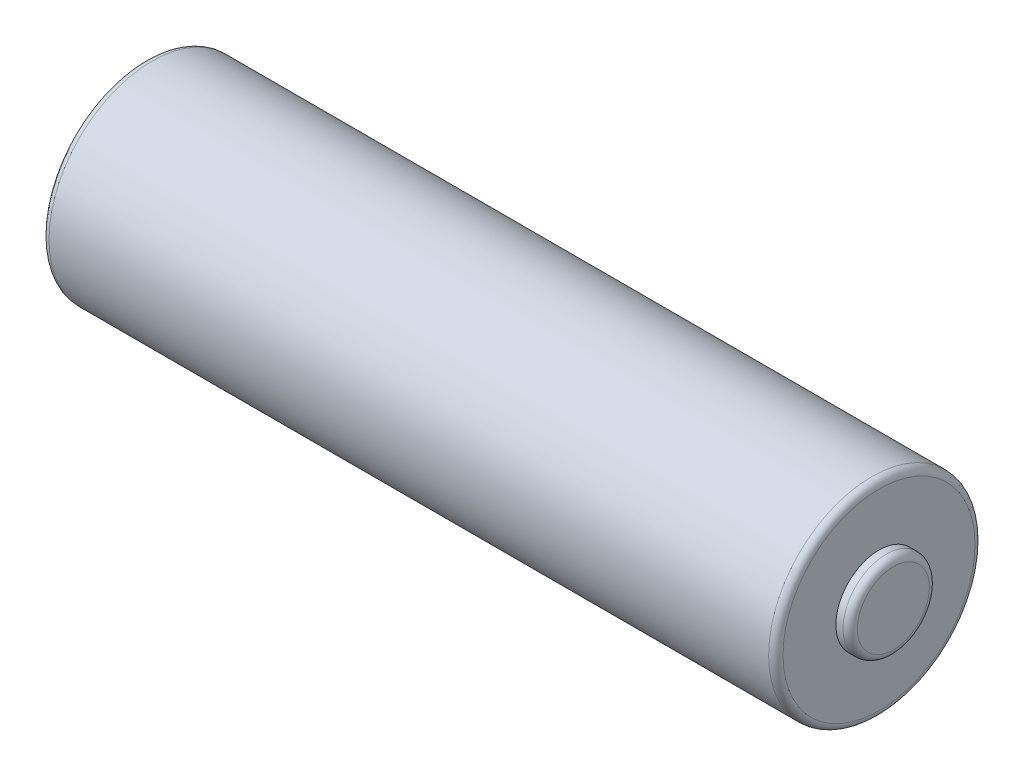
ISO-10303-21;
HEADER;
FILE_DESCRIPTION(('STEP AP214'),'2;1');
FILE_NAME('part.step','',(''),(''),'','','');
FILE_SCHEMA(('AUTOMOTIVE_DESIGN { 1 0 10303 214 1 1 1 1 }'));
ENDSEC;
DATA;
#1=APPLICATION_CONTEXT('core data for automotive mechanical design processes');
#2=APPLICATION_PROTOCOL_DEFINITION('international standard','automotive_design',2000,#1);
#3=PRODUCT_CONTEXT('',#1,'mechanical');
#4=PRODUCT('Part','Part','',(#3));
#5=PRODUCT_RELATED_PRODUCT_CATEGORY('part','',(#4));
#6=PRODUCT_DEFINITION_FORMATION('','',#4);
#7=PRODUCT_DEFINITION_CONTEXT('part definition',#1,'design');
#8=PRODUCT_DEFINITION('design','',#6,#7);
#9=PRODUCT_DEFINITION_SHAPE('','',#8);
#10=(LENGTH_UNIT() NAMED_UNIT(*) SI_UNIT(.MILLI.,.METRE.));
#11=(NAMED_UNIT(*) PLANE_ANGLE_UNIT() SI_UNIT($,.RADIAN.));
#12=(NAMED_UNIT(*) SI_UNIT($,.STERADIAN.) SOLID_ANGLE_UNIT());
#13=UNCERTAINTY_MEASURE_WITH_UNIT(LENGTH_MEASURE(1.E-05),#10,'distance_accuracy_value','');
#14=(GEOMETRIC_REPRESENTATION_CONTEXT(3) GLOBAL_UNCERTAINTY_ASSIGNED_CONTEXT((#13)) GLOBAL_UNIT_ASSIGNED_CONTEXT((#10,
#11,#12)) REPRESENTATION_CONTEXT('',''));
#15=CARTESIAN_POINT('',(0.,0.,0.));
#16=DIRECTION('',(0.,0.,1.));
#17=DIRECTION('',(1.,0.,0.));
#18=AXIS2_PLACEMENT_3D('',#15,#16,#17);
#19=CARTESIAN_POINT('',(25.5,0.,0.));
#20=DIRECTION('',(-1.,0.,0.));
#21=DIRECTION('',(0.,0.,1.));
#22=AXIS2_PLACEMENT_3D('',#19,#20,#21);
#23=CYLINDRICAL_SURFACE('',#22,7.17);
#24=CARTESIAN_POINT('',(-25.,0.,0.));
#25=DIRECTION('',(1.,0.,0.));
#26=DIRECTION('',(0.,0.,-1.));
#27=AXIS2_PLACEMENT_3D('',#24,#25,#26);
#28=CIRCLE('',#27,7.17);
#29=CARTESIAN_POINT('',(-25.,0.,-7.17));
#30=VERTEX_POINT('',#29);
#31=EDGE_CURVE('E57',#30,#30,#28,.T.);
#32=ORIENTED_EDGE('',*,*,#31,.T.);
#33=EDGE_LOOP('',(#32));
#34=FACE_BOUND('',#33,.T.);
#35=CARTESIAN_POINT('',(25.,0.,0.));
#36=DIRECTION('',(1.,0.,0.));
#37=DIRECTION('',(0.,0.,-1.));
#38=AXIS2_PLACEMENT_3D('',#35,#36,#37);
#39=CIRCLE('',#38,7.17);
#40=CARTESIAN_POINT('',(25.,0.,-7.17));
#41=VERTEX_POINT('',#40);
#42=EDGE_CURVE('E61',#41,#41,#39,.F.);
#43=ORIENTED_EDGE('',*,*,#42,.T.);
#44=EDGE_LOOP('',(#43));
#45=FACE_BOUND('',#44,.T.);
#46=ADVANCED_FACE('F42',(#34,#45),#23,.T.);
#47=CARTESIAN_POINT('',(25.5,0.,0.));
#48=DIRECTION('',(1.,0.,0.));
#49=DIRECTION('',(0.,0.,-1.));
#50=AXIS2_PLACEMENT_3D('',#47,#48,#49);
#51=PLANE('',#50);
#52=CARTESIAN_POINT('',(25.5,0.,0.));
#53=DIRECTION('',(1.,0.,0.));
#54=DIRECTION('',(0.,0.,-1.));
#55=AXIS2_PLACEMENT_3D('',#52,#53,#54);
#56=CIRCLE('',#55,6.67);
#57=CARTESIAN_POINT('',(25.5,0.,-6.67));
#58=VERTEX_POINT('',#57);
#59=EDGE_CURVE('E10',#58,#58,#56,.T.);
#60=ORIENTED_EDGE('',*,*,#59,.T.);
#61=EDGE_LOOP('',(#60));
#62=FACE_BOUND('',#61,.T.);
#63=CARTESIAN_POINT('',(25.5,0.,0.));
#64=DIRECTION('',(1.,0.,0.));
#65=DIRECTION('',(0.,0.,-1.));
#66=AXIS2_PLACEMENT_3D('',#63,#64,#65);
#67=CIRCLE('',#66,3.);
#68=CARTESIAN_POINT('',(25.5,0.,-3.));
#69=VERTEX_POINT('',#68);
#70=EDGE_CURVE('E74',#69,#69,#67,.T.);
#71=ORIENTED_EDGE('',*,*,#70,.F.);
#72=EDGE_LOOP('',(#71));
#73=FACE_BOUND('',#72,.T.);
#74=ADVANCED_FACE('F81',(#62,#73),#51,.T.);
#75=CARTESIAN_POINT('',(-25.5,0.,0.));
#76=DIRECTION('',(1.,0.,0.));
#77=DIRECTION('',(0.,0.,-1.));
#78=AXIS2_PLACEMENT_3D('',#75,#76,#77);
#79=PLANE('',#78);
#80=CARTESIAN_POINT('',(-25.5,0.,0.));
#81=DIRECTION('',(1.,0.,0.));
#82=DIRECTION('',(0.,0.,-1.));
#83=AXIS2_PLACEMENT_3D('',#80,#81,#82);
#84=CIRCLE('',#83,6.67);
#85=CARTESIAN_POINT('',(-25.5,0.,-6.67));
#86=VERTEX_POINT('',#85);
#87=EDGE_CURVE('E50',#86,#86,#84,.F.);
#88=ORIENTED_EDGE('',*,*,#87,.T.);
#89=EDGE_LOOP('',(#88));
#90=FACE_BOUND('',#89,.T.);
#91=ADVANCED_FACE('F83',(#90),#79,.F.);
#92=CARTESIAN_POINT('',(26.5,0.,0.));
#93=DIRECTION('',(-1.,0.,0.));
#94=DIRECTION('',(0.,0.,1.));
#95=AXIS2_PLACEMENT_3D('',#92,#93,#94);
#96=CYLINDRICAL_SURFACE('',#95,3.);
#97=CARTESIAN_POINT('',(26.,0.,0.));
#98=DIRECTION('',(1.,0.,0.));
#99=DIRECTION('',(0.,0.,-1.));
#100=AXIS2_PLACEMENT_3D('',#97,#98,#99);
#101=CIRCLE('',#100,3.);
#102=CARTESIAN_POINT('',(26.,0.,-3.));
#103=VERTEX_POINT('',#102);
#104=EDGE_CURVE('E66',#103,#103,#101,.F.);
#105=ORIENTED_EDGE('',*,*,#104,.T.);
#106=EDGE_LOOP('',(#105));
#107=FACE_BOUND('',#106,.T.);
#108=ORIENTED_EDGE('',*,*,#70,.T.);
#109=EDGE_LOOP('',(#108));
#110=FACE_BOUND('',#109,.T.);
#111=ADVANCED_FACE('F79',(#107,#110),#96,.T.);
#112=CARTESIAN_POINT('',(26.5,0.,0.));
#113=DIRECTION('',(1.,0.,0.));
#114=DIRECTION('',(0.,0.,-1.));
#115=AXIS2_PLACEMENT_3D('',#112,#113,#114);
#116=PLANE('',#115);
#117=CARTESIAN_POINT('',(26.5,0.,0.));
#118=DIRECTION('',(1.,0.,0.));
#119=DIRECTION('',(0.,0.,-1.));
#120=AXIS2_PLACEMENT_3D('',#117,#118,#119);
#121=CIRCLE('',#120,2.5);
#122=CARTESIAN_POINT('',(26.5,0.,-2.5));
#123=VERTEX_POINT('',#122);
#124=EDGE_CURVE('E70',#123,#123,#121,.T.);
#125=ORIENTED_EDGE('',*,*,#124,.T.);
#126=EDGE_LOOP('',(#125));
#127=FACE_BOUND('',#126,.T.);
#128=ADVANCED_FACE('F98',(#127),#116,.T.);
#129=CARTESIAN_POINT('',(26.,0.,0.));
#130=DIRECTION('',(1.,0.,0.));
#131=DIRECTION('',(0.,0.,-1.));
#132=AXIS2_PLACEMENT_3D('',#129,#130,#131);
#133=TOROIDAL_SURFACE('',#132,2.5,0.5);
#134=ORIENTED_EDGE('',*,*,#104,.F.);
#135=EDGE_LOOP('',(#134));
#136=FACE_BOUND('',#135,.T.);
#137=ORIENTED_EDGE('',*,*,#124,.F.);
#138=EDGE_LOOP('',(#137));
#139=FACE_BOUND('',#138,.T.);
#140=ADVANCED_FACE('F95',(#136,#139),#133,.T.);
#141=CARTESIAN_POINT('',(-25.,0.,0.));
#142=DIRECTION('',(1.,0.,0.));
#143=DIRECTION('',(0.,0.,-1.));
#144=AXIS2_PLACEMENT_3D('',#141,#142,#143);
#145=TOROIDAL_SURFACE('',#144,6.67,0.5);
#146=ORIENTED_EDGE('',*,*,#87,.F.);
#147=EDGE_LOOP('',(#146));
#148=FACE_BOUND('',#147,.T.);
#149=ORIENTED_EDGE('',*,*,#31,.F.);
#150=EDGE_LOOP('',(#149));
#151=FACE_BOUND('',#150,.T.);
#152=ADVANCED_FACE('F97',(#148,#151),#145,.T.);
#153=CARTESIAN_POINT('',(25.,0.,0.));
#154=DIRECTION('',(1.,0.,0.));
#155=DIRECTION('',(0.,0.,-1.));
#156=AXIS2_PLACEMENT_3D('',#153,#154,#155);
#157=TOROIDAL_SURFACE('',#156,6.67,0.5);
#158=ORIENTED_EDGE('',*,*,#42,.F.);
#159=EDGE_LOOP('',(#158));
#160=FACE_BOUND('',#159,.T.);
#161=ORIENTED_EDGE('',*,*,#59,.F.);
#162=EDGE_LOOP('',(#161));
#163=FACE_BOUND('',#162,.T.);
#164=ADVANCED_FACE('F44',(#160,#163),#157,.T.);
#165=CLOSED_SHELL('',(#46,#74,#91,#111,#128,#140,#152,#164));
#166=MANIFOLD_SOLID_BREP('B2',#165);
#167=ADVANCED_BREP_SHAPE_REPRESENTATION('',(#18,#166),#14);
#168=SHAPE_DEFINITION_REPRESENTATION(#9,#167);
ENDSEC;
END-ISO-10303-21;
